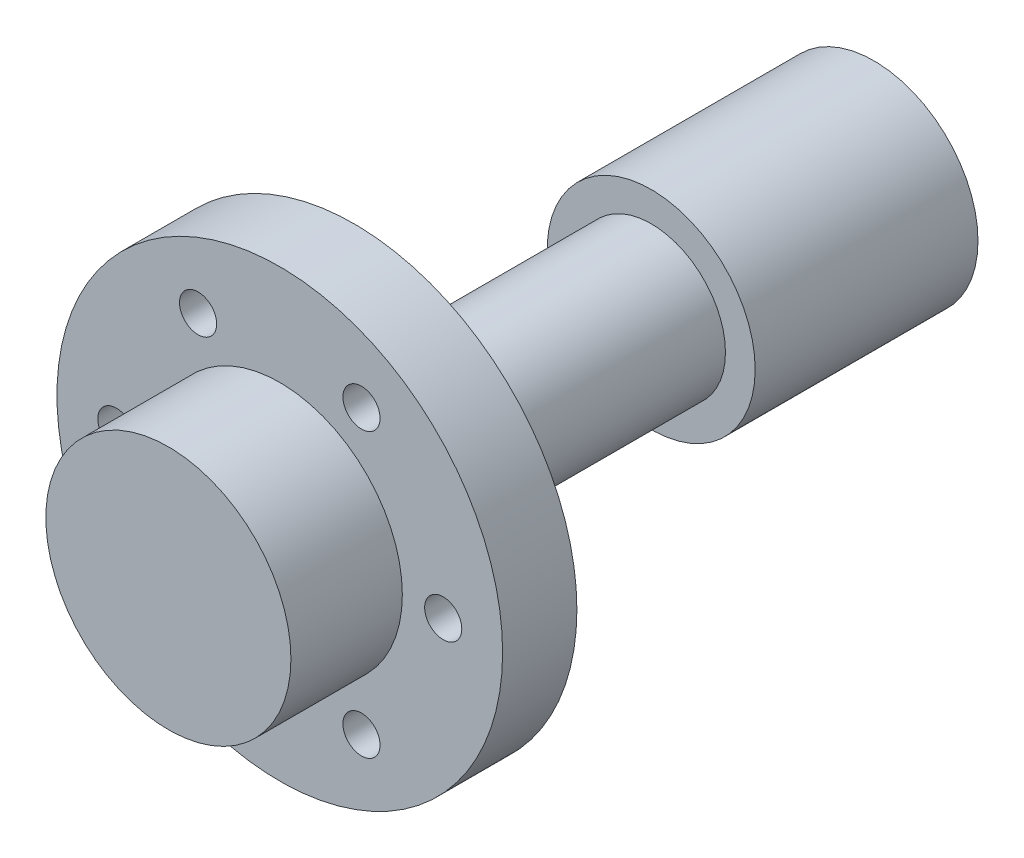
ISO-10303-21;
HEADER;
FILE_DESCRIPTION(('STEP AP214'),'2;1');
FILE_NAME('part.step','',(''),(''),'','','');
FILE_SCHEMA(('AUTOMOTIVE_DESIGN { 1 0 10303 214 1 1 1 1 }'));
ENDSEC;
DATA;
#1=APPLICATION_CONTEXT('core data for automotive mechanical design processes');
#2=APPLICATION_PROTOCOL_DEFINITION('international standard','automotive_design',2000,#1);
#3=PRODUCT_CONTEXT('',#1,'mechanical');
#4=PRODUCT('Part','Part','',(#3));
#5=PRODUCT_RELATED_PRODUCT_CATEGORY('part','',(#4));
#6=PRODUCT_DEFINITION_FORMATION('','',#4);
#7=PRODUCT_DEFINITION_CONTEXT('part definition',#1,'design');
#8=PRODUCT_DEFINITION('design','',#6,#7);
#9=PRODUCT_DEFINITION_SHAPE('','',#8);
#10=(LENGTH_UNIT() NAMED_UNIT(*) SI_UNIT(.MILLI.,.METRE.));
#11=(NAMED_UNIT(*) PLANE_ANGLE_UNIT() SI_UNIT($,.RADIAN.));
#12=(NAMED_UNIT(*) SI_UNIT($,.STERADIAN.) SOLID_ANGLE_UNIT());
#13=UNCERTAINTY_MEASURE_WITH_UNIT(LENGTH_MEASURE(1.E-05),#10,'distance_accuracy_value','');
#14=(GEOMETRIC_REPRESENTATION_CONTEXT(3) GLOBAL_UNCERTAINTY_ASSIGNED_CONTEXT((#13)) GLOBAL_UNIT_ASSIGNED_CONTEXT((#10,
#11,#12)) REPRESENTATION_CONTEXT('',''));
#15=CARTESIAN_POINT('',(0.,0.,0.));
#16=DIRECTION('',(0.,0.,1.));
#17=DIRECTION('',(1.,0.,0.));
#18=AXIS2_PLACEMENT_3D('',#15,#16,#17);
#19=CARTESIAN_POINT('',(0.,0.,30.));
#20=DIRECTION('',(0.,0.,-1.));
#21=DIRECTION('',(-1.,0.,0.));
#22=AXIS2_PLACEMENT_3D('',#19,#20,#21);
#23=CYLINDRICAL_SURFACE('',#22,14.);
#24=CARTESIAN_POINT('',(0.,0.,30.));
#25=DIRECTION('',(0.,0.,1.));
#26=DIRECTION('',(1.,0.,0.));
#27=AXIS2_PLACEMENT_3D('',#24,#25,#26);
#28=CIRCLE('',#27,14.);
#29=CARTESIAN_POINT('',(14.,0.,30.));
#30=VERTEX_POINT('',#29);
#31=EDGE_CURVE('E57',#30,#30,#28,.T.);
#32=ORIENTED_EDGE('',*,*,#31,.F.);
#33=EDGE_LOOP('',(#32));
#34=FACE_BOUND('',#33,.T.);
#35=CARTESIAN_POINT('',(0.,0.,0.));
#36=DIRECTION('',(0.,0.,1.));
#37=DIRECTION('',(1.,0.,0.));
#38=AXIS2_PLACEMENT_3D('',#35,#36,#37);
#39=CIRCLE('',#38,14.);
#40=CARTESIAN_POINT('',(14.,0.,0.));
#41=VERTEX_POINT('',#40);
#42=EDGE_CURVE('E46',#41,#41,#39,.T.);
#43=ORIENTED_EDGE('',*,*,#42,.T.);
#44=EDGE_LOOP('',(#43));
#45=FACE_BOUND('',#44,.T.);
#46=ADVANCED_FACE('F43',(#34,#45),#23,.T.);
#47=CARTESIAN_POINT('',(0.,0.,30.));
#48=DIRECTION('',(0.,0.,1.));
#49=DIRECTION('',(1.,0.,0.));
#50=AXIS2_PLACEMENT_3D('',#47,#48,#49);
#51=PLANE('',#50);
#52=CARTESIAN_POINT('',(0.,0.,30.));
#53=DIRECTION('',(0.,0.,1.));
#54=DIRECTION('',(1.,0.,0.));
#55=AXIS2_PLACEMENT_3D('',#52,#53,#54);
#56=CIRCLE('',#55,10.);
#57=CARTESIAN_POINT('',(10.,0.,30.));
#58=VERTEX_POINT('',#57);
#59=EDGE_CURVE('E51',#58,#58,#56,.T.);
#60=ORIENTED_EDGE('',*,*,#59,.F.);
#61=EDGE_LOOP('',(#60));
#62=FACE_BOUND('',#61,.T.);
#63=ORIENTED_EDGE('',*,*,#31,.T.);
#64=EDGE_LOOP('',(#63));
#65=FACE_BOUND('',#64,.T.);
#66=ADVANCED_FACE('F86',(#62,#65),#51,.T.);
#67=CARTESIAN_POINT('',(0.,0.,0.));
#68=DIRECTION('',(0.,0.,1.));
#69=DIRECTION('',(1.,0.,0.));
#70=AXIS2_PLACEMENT_3D('',#67,#68,#69);
#71=PLANE('',#70);
#72=CARTESIAN_POINT('',(0.,0.,0.));
#73=DIRECTION('',(0.,0.,-1.));
#74=DIRECTION('',(-1.,0.,0.));
#75=AXIS2_PLACEMENT_3D('',#72,#73,#74);
#76=CIRCLE('',#75,7.);
#77=CARTESIAN_POINT('',(-7.,0.,0.));
#78=VERTEX_POINT('',#77);
#79=EDGE_CURVE('E295',#78,#78,#76,.T.);
#80=ORIENTED_EDGE('',*,*,#79,.F.);
#81=EDGE_LOOP('',(#80));
#82=FACE_BOUND('',#81,.T.);
#83=ORIENTED_EDGE('',*,*,#42,.F.);
#84=EDGE_LOOP('',(#83));
#85=FACE_BOUND('',#84,.T.);
#86=ADVANCED_FACE('F83',(#82,#85),#71,.F.);
#87=CARTESIAN_POINT('',(0.,0.,70.));
#88=DIRECTION('',(0.,0.,-1.));
#89=DIRECTION('',(-1.,0.,0.));
#90=AXIS2_PLACEMENT_3D('',#87,#88,#89);
#91=CYLINDRICAL_SURFACE('',#90,10.);
#92=CARTESIAN_POINT('',(0.,0.,70.));
#93=DIRECTION('',(0.,0.,1.));
#94=DIRECTION('',(1.,0.,0.));
#95=AXIS2_PLACEMENT_3D('',#92,#93,#94);
#96=CIRCLE('',#95,10.);
#97=CARTESIAN_POINT('',(10.,0.,70.));
#98=VERTEX_POINT('',#97);
#99=EDGE_CURVE('E67',#98,#98,#96,.T.);
#100=ORIENTED_EDGE('',*,*,#99,.F.);
#101=EDGE_LOOP('',(#100));
#102=FACE_BOUND('',#101,.T.);
#103=ORIENTED_EDGE('',*,*,#59,.T.);
#104=EDGE_LOOP('',(#103));
#105=FACE_BOUND('',#104,.T.);
#106=ADVANCED_FACE('F85',(#102,#105),#91,.T.);
#107=CARTESIAN_POINT('',(0.,0.,80.));
#108=DIRECTION('',(0.,0.,-1.));
#109=DIRECTION('',(-1.,0.,0.));
#110=AXIS2_PLACEMENT_3D('',#107,#108,#109);
#111=CYLINDRICAL_SURFACE('',#110,30.);
#112=CARTESIAN_POINT('',(0.,0.,80.));
#113=DIRECTION('',(0.,0.,1.));
#114=DIRECTION('',(1.,0.,0.));
#115=AXIS2_PLACEMENT_3D('',#112,#113,#114);
#116=CIRCLE('',#115,30.);
#117=CARTESIAN_POINT('',(30.,0.,80.));
#118=VERTEX_POINT('',#117);
#119=EDGE_CURVE('E63',#118,#118,#116,.T.);
#120=ORIENTED_EDGE('',*,*,#119,.F.);
#121=EDGE_LOOP('',(#120));
#122=FACE_BOUND('',#121,.T.);
#123=CARTESIAN_POINT('',(0.,0.,70.));
#124=DIRECTION('',(0.,0.,1.));
#125=DIRECTION('',(1.,0.,0.));
#126=AXIS2_PLACEMENT_3D('',#123,#124,#125);
#127=CIRCLE('',#126,30.);
#128=CARTESIAN_POINT('',(30.,0.,70.));
#129=VERTEX_POINT('',#128);
#130=EDGE_CURVE('E68',#129,#129,#127,.T.);
#131=ORIENTED_EDGE('',*,*,#130,.T.);
#132=EDGE_LOOP('',(#131));
#133=FACE_BOUND('',#132,.T.);
#134=ADVANCED_FACE('F93',(#122,#133),#111,.T.);
#135=CARTESIAN_POINT('',(0.,0.,80.));
#136=DIRECTION('',(0.,0.,1.));
#137=DIRECTION('',(1.,0.,0.));
#138=AXIS2_PLACEMENT_3D('',#135,#136,#137);
#139=PLANE('',#138);
#140=CARTESIAN_POINT('',(22.,0.,80.));
#141=DIRECTION('',(0.,0.,1.));
#142=DIRECTION('',(1.,0.,0.));
#143=AXIS2_PLACEMENT_3D('',#140,#141,#142);
#144=CIRCLE('',#143,2.5);
#145=CARTESIAN_POINT('',(24.5,0.,80.));
#146=VERTEX_POINT('',#145);
#147=EDGE_CURVE('E271',#146,#146,#144,.T.);
#148=ORIENTED_EDGE('',*,*,#147,.F.);
#149=EDGE_LOOP('',(#148));
#150=FACE_BOUND('',#149,.T.);
#151=CARTESIAN_POINT('',(11.,-19.0525588832576,80.));
#152=DIRECTION('',(0.,0.,1.));
#153=DIRECTION('',(1.,0.,0.));
#154=AXIS2_PLACEMENT_3D('',#151,#152,#153);
#155=CIRCLE('',#154,2.49999999999988);
#156=CARTESIAN_POINT('',(13.4999999999999,-19.0525588832576,80.));
#157=VERTEX_POINT('',#156);
#158=EDGE_CURVE('E291',#157,#157,#155,.T.);
#159=ORIENTED_EDGE('',*,*,#158,.F.);
#160=EDGE_LOOP('',(#159));
#161=FACE_BOUND('',#160,.T.);
#162=CARTESIAN_POINT('',(-11.,-19.0525588832576,80.));
#163=DIRECTION('',(0.,0.,1.));
#164=DIRECTION('',(1.,0.,0.));
#165=AXIS2_PLACEMENT_3D('',#162,#163,#164);
#166=CIRCLE('',#165,2.49999999999989);
#167=CARTESIAN_POINT('',(-8.50000000000007,-19.0525588832576,80.));
#168=VERTEX_POINT('',#167);
#169=EDGE_CURVE('E285',#168,#168,#166,.T.);
#170=ORIENTED_EDGE('',*,*,#169,.F.);
#171=EDGE_LOOP('',(#170));
#172=FACE_BOUND('',#171,.T.);
#173=CARTESIAN_POINT('',(-22.,0.,80.));
#174=DIRECTION('',(0.,0.,1.));
#175=DIRECTION('',(1.,0.,0.));
#176=AXIS2_PLACEMENT_3D('',#173,#174,#175);
#177=CIRCLE('',#176,2.5);
#178=CARTESIAN_POINT('',(-19.5,0.,80.));
#179=VERTEX_POINT('',#178);
#180=EDGE_CURVE('E279',#179,#179,#177,.T.);
#181=ORIENTED_EDGE('',*,*,#180,.F.);
#182=EDGE_LOOP('',(#181));
#183=FACE_BOUND('',#182,.T.);
#184=CARTESIAN_POINT('',(-11.,19.0525588832576,80.));
#185=DIRECTION('',(0.,0.,1.));
#186=DIRECTION('',(1.,0.,0.));
#187=AXIS2_PLACEMENT_3D('',#184,#185,#186);
#188=CIRCLE('',#187,2.5);
#189=CARTESIAN_POINT('',(-8.49999999999996,19.0525588832576,80.));
#190=VERTEX_POINT('',#189);
#191=EDGE_CURVE('E266',#190,#190,#188,.T.);
#192=ORIENTED_EDGE('',*,*,#191,.F.);
#193=EDGE_LOOP('',(#192));
#194=FACE_BOUND('',#193,.T.);
#195=CARTESIAN_POINT('',(11.,19.0525588832576,80.));
#196=DIRECTION('',(0.,0.,1.));
#197=DIRECTION('',(1.,0.,0.));
#198=AXIS2_PLACEMENT_3D('',#195,#196,#197);
#199=CIRCLE('',#198,2.5);
#200=CARTESIAN_POINT('',(13.5,19.0525588832576,80.));
#201=VERTEX_POINT('',#200);
#202=EDGE_CURVE('E265',#201,#201,#199,.T.);
#203=ORIENTED_EDGE('',*,*,#202,.F.);
#204=EDGE_LOOP('',(#203));
#205=FACE_BOUND('',#204,.T.);
#206=CARTESIAN_POINT('',(0.,0.,80.));
#207=DIRECTION('',(0.,0.,1.));
#208=DIRECTION('',(1.,0.,0.));
#209=AXIS2_PLACEMENT_3D('',#206,#207,#208);
#210=CIRCLE('',#209,16.5);
#211=CARTESIAN_POINT('',(16.5,0.,80.));
#212=VERTEX_POINT('',#211);
#213=EDGE_CURVE('E10',#212,#212,#210,.T.);
#214=ORIENTED_EDGE('',*,*,#213,.F.);
#215=EDGE_LOOP('',(#214));
#216=FACE_BOUND('',#215,.T.);
#217=ORIENTED_EDGE('',*,*,#119,.T.);
#218=EDGE_LOOP('',(#217));
#219=FACE_BOUND('',#218,.T.);
#220=ADVANCED_FACE('F121',(#150,#161,#172,#183,#194,#205,#216,#219),#139,.T.);
#221=CARTESIAN_POINT('',(0.,0.,70.));
#222=DIRECTION('',(0.,0.,1.));
#223=DIRECTION('',(1.,0.,0.));
#224=AXIS2_PLACEMENT_3D('',#221,#222,#223);
#225=PLANE('',#224);
#226=CARTESIAN_POINT('',(22.,0.,70.));
#227=DIRECTION('',(0.,0.,1.));
#228=DIRECTION('',(1.,0.,0.));
#229=AXIS2_PLACEMENT_3D('',#226,#227,#228);
#230=CIRCLE('',#229,2.5);
#231=CARTESIAN_POINT('',(24.5,0.,70.));
#232=VERTEX_POINT('',#231);
#233=EDGE_CURVE('E237',#232,#232,#230,.T.);
#234=ORIENTED_EDGE('',*,*,#233,.T.);
#235=EDGE_LOOP('',(#234));
#236=FACE_BOUND('',#235,.T.);
#237=CARTESIAN_POINT('',(11.,-19.0525588832576,70.));
#238=DIRECTION('',(0.,0.,1.));
#239=DIRECTION('',(1.,0.,0.));
#240=AXIS2_PLACEMENT_3D('',#237,#238,#239);
#241=CIRCLE('',#240,2.49999999999988);
#242=CARTESIAN_POINT('',(13.4999999999999,-19.0525588832576,70.));
#243=VERTEX_POINT('',#242);
#244=EDGE_CURVE('E241',#243,#243,#241,.T.);
#245=ORIENTED_EDGE('',*,*,#244,.T.);
#246=EDGE_LOOP('',(#245));
#247=FACE_BOUND('',#246,.T.);
#248=CARTESIAN_POINT('',(-11.,-19.0525588832576,70.));
#249=DIRECTION('',(0.,0.,1.));
#250=DIRECTION('',(1.,0.,0.));
#251=AXIS2_PLACEMENT_3D('',#248,#249,#250);
#252=CIRCLE('',#251,2.49999999999989);
#253=CARTESIAN_POINT('',(-8.50000000000007,-19.0525588832576,70.));
#254=VERTEX_POINT('',#253);
#255=EDGE_CURVE('E245',#254,#254,#252,.T.);
#256=ORIENTED_EDGE('',*,*,#255,.T.);
#257=EDGE_LOOP('',(#256));
#258=FACE_BOUND('',#257,.T.);
#259=CARTESIAN_POINT('',(-22.,0.,70.));
#260=DIRECTION('',(0.,0.,1.));
#261=DIRECTION('',(1.,0.,0.));
#262=AXIS2_PLACEMENT_3D('',#259,#260,#261);
#263=CIRCLE('',#262,2.5);
#264=CARTESIAN_POINT('',(-19.5,0.,70.));
#265=VERTEX_POINT('',#264);
#266=EDGE_CURVE('E249',#265,#265,#263,.T.);
#267=ORIENTED_EDGE('',*,*,#266,.T.);
#268=EDGE_LOOP('',(#267));
#269=FACE_BOUND('',#268,.T.);
#270=CARTESIAN_POINT('',(-11.,19.0525588832576,70.));
#271=DIRECTION('',(0.,0.,1.));
#272=DIRECTION('',(1.,0.,0.));
#273=AXIS2_PLACEMENT_3D('',#270,#271,#272);
#274=CIRCLE('',#273,2.5);
#275=CARTESIAN_POINT('',(-8.49999999999996,19.0525588832576,70.));
#276=VERTEX_POINT('',#275);
#277=EDGE_CURVE('E253',#276,#276,#274,.T.);
#278=ORIENTED_EDGE('',*,*,#277,.T.);
#279=EDGE_LOOP('',(#278));
#280=FACE_BOUND('',#279,.T.);
#281=CARTESIAN_POINT('',(11.,19.0525588832576,70.));
#282=DIRECTION('',(0.,0.,1.));
#283=DIRECTION('',(1.,0.,0.));
#284=AXIS2_PLACEMENT_3D('',#281,#282,#283);
#285=CIRCLE('',#284,2.5);
#286=CARTESIAN_POINT('',(13.5,19.0525588832576,70.));
#287=VERTEX_POINT('',#286);
#288=EDGE_CURVE('E257',#287,#287,#285,.T.);
#289=ORIENTED_EDGE('',*,*,#288,.T.);
#290=EDGE_LOOP('',(#289));
#291=FACE_BOUND('',#290,.T.);
#292=ORIENTED_EDGE('',*,*,#99,.T.);
#293=EDGE_LOOP('',(#292));
#294=FACE_BOUND('',#293,.T.);
#295=ORIENTED_EDGE('',*,*,#130,.F.);
#296=EDGE_LOOP('',(#295));
#297=FACE_BOUND('',#296,.T.);
#298=ADVANCED_FACE('F132',(#236,#247,#258,#269,#280,#291,#294,#297),#225,.F.);
#299=CARTESIAN_POINT('',(0.,0.,95.));
#300=DIRECTION('',(0.,0.,-1.));
#301=DIRECTION('',(-1.,0.,0.));
#302=AXIS2_PLACEMENT_3D('',#299,#300,#301);
#303=CYLINDRICAL_SURFACE('',#302,16.5);
#304=CARTESIAN_POINT('',(0.,0.,95.));
#305=DIRECTION('',(0.,0.,1.));
#306=DIRECTION('',(1.,0.,0.));
#307=AXIS2_PLACEMENT_3D('',#304,#305,#306);
#308=CIRCLE('',#307,16.5);
#309=CARTESIAN_POINT('',(16.5,0.,95.));
#310=VERTEX_POINT('',#309);
#311=EDGE_CURVE('E61',#310,#310,#308,.T.);
#312=ORIENTED_EDGE('',*,*,#311,.F.);
#313=EDGE_LOOP('',(#312));
#314=FACE_BOUND('',#313,.T.);
#315=ORIENTED_EDGE('',*,*,#213,.T.);
#316=EDGE_LOOP('',(#315));
#317=FACE_BOUND('',#316,.T.);
#318=ADVANCED_FACE('F128',(#314,#317),#303,.T.);
#319=CARTESIAN_POINT('',(0.,0.,95.));
#320=DIRECTION('',(0.,0.,1.));
#321=DIRECTION('',(1.,0.,0.));
#322=AXIS2_PLACEMENT_3D('',#319,#320,#321);
#323=PLANE('',#322);
#324=ORIENTED_EDGE('',*,*,#311,.T.);
#325=EDGE_LOOP('',(#324));
#326=FACE_BOUND('',#325,.T.);
#327=ADVANCED_FACE('F131',(#326),#323,.T.);
#328=CARTESIAN_POINT('',(0.,0.,25.));
#329=DIRECTION('',(0.,0.,-1.));
#330=DIRECTION('',(-1.,0.,0.));
#331=AXIS2_PLACEMENT_3D('',#328,#329,#330);
#332=CYLINDRICAL_SURFACE('',#331,7.);
#333=CARTESIAN_POINT('',(0.,0.,25.));
#334=DIRECTION('',(0.,0.,-1.));
#335=DIRECTION('',(-1.,0.,0.));
#336=AXIS2_PLACEMENT_3D('',#333,#334,#335);
#337=CIRCLE('',#336,7.);
#338=CARTESIAN_POINT('',(-7.,0.,25.));
#339=VERTEX_POINT('',#338);
#340=EDGE_CURVE('E292',#339,#339,#337,.T.);
#341=ORIENTED_EDGE('',*,*,#340,.F.);
#342=EDGE_LOOP('',(#341));
#343=FACE_BOUND('',#342,.T.);
#344=ORIENTED_EDGE('',*,*,#79,.T.);
#345=EDGE_LOOP('',(#344));
#346=FACE_BOUND('',#345,.T.);
#347=ADVANCED_FACE('F141',(#343,#346),#332,.F.);
#348=CARTESIAN_POINT('',(0.,0.,25.));
#349=DIRECTION('',(0.,0.,-1.));
#350=DIRECTION('',(-1.,0.,0.));
#351=AXIS2_PLACEMENT_3D('',#348,#349,#350);
#352=PLANE('',#351);
#353=ORIENTED_EDGE('',*,*,#340,.T.);
#354=EDGE_LOOP('',(#353));
#355=FACE_BOUND('',#354,.T.);
#356=ADVANCED_FACE('F153',(#355),#352,.T.);
#357=CARTESIAN_POINT('',(11.,19.0525588832576,70.));
#358=DIRECTION('',(0.,0.,1.));
#359=DIRECTION('',(1.,0.,0.));
#360=AXIS2_PLACEMENT_3D('',#357,#358,#359);
#361=CYLINDRICAL_SURFACE('',#360,2.5);
#362=ORIENTED_EDGE('',*,*,#288,.F.);
#363=EDGE_LOOP('',(#362));
#364=FACE_BOUND('',#363,.T.);
#365=ORIENTED_EDGE('',*,*,#202,.T.);
#366=EDGE_LOOP('',(#365));
#367=FACE_BOUND('',#366,.T.);
#368=ADVANCED_FACE('F163',(#364,#367),#361,.F.);
#369=CARTESIAN_POINT('',(-11.,19.0525588832576,70.));
#370=DIRECTION('',(0.,0.,1.));
#371=DIRECTION('',(1.,0.,0.));
#372=AXIS2_PLACEMENT_3D('',#369,#370,#371);
#373=CYLINDRICAL_SURFACE('',#372,2.5);
#374=ORIENTED_EDGE('',*,*,#277,.F.);
#375=EDGE_LOOP('',(#374));
#376=FACE_BOUND('',#375,.T.);
#377=ORIENTED_EDGE('',*,*,#191,.T.);
#378=EDGE_LOOP('',(#377));
#379=FACE_BOUND('',#378,.T.);
#380=ADVANCED_FACE('F174',(#376,#379),#373,.F.);
#381=CARTESIAN_POINT('',(-22.,0.,70.));
#382=DIRECTION('',(0.,0.,1.));
#383=DIRECTION('',(1.,0.,0.));
#384=AXIS2_PLACEMENT_3D('',#381,#382,#383);
#385=CYLINDRICAL_SURFACE('',#384,2.5);
#386=ORIENTED_EDGE('',*,*,#266,.F.);
#387=EDGE_LOOP('',(#386));
#388=FACE_BOUND('',#387,.T.);
#389=ORIENTED_EDGE('',*,*,#180,.T.);
#390=EDGE_LOOP('',(#389));
#391=FACE_BOUND('',#390,.T.);
#392=ADVANCED_FACE('F185',(#388,#391),#385,.F.);
#393=CARTESIAN_POINT('',(-11.,-19.0525588832576,70.));
#394=DIRECTION('',(0.,0.,1.));
#395=DIRECTION('',(1.,0.,0.));
#396=AXIS2_PLACEMENT_3D('',#393,#394,#395);
#397=CYLINDRICAL_SURFACE('',#396,2.49999999999989);
#398=ORIENTED_EDGE('',*,*,#255,.F.);
#399=EDGE_LOOP('',(#398));
#400=FACE_BOUND('',#399,.T.);
#401=ORIENTED_EDGE('',*,*,#169,.T.);
#402=EDGE_LOOP('',(#401));
#403=FACE_BOUND('',#402,.T.);
#404=ADVANCED_FACE('F195',(#400,#403),#397,.F.);
#405=CARTESIAN_POINT('',(11.,-19.0525588832576,70.));
#406=DIRECTION('',(0.,0.,1.));
#407=DIRECTION('',(1.,0.,0.));
#408=AXIS2_PLACEMENT_3D('',#405,#406,#407);
#409=CYLINDRICAL_SURFACE('',#408,2.49999999999988);
#410=ORIENTED_EDGE('',*,*,#244,.F.);
#411=EDGE_LOOP('',(#410));
#412=FACE_BOUND('',#411,.T.);
#413=ORIENTED_EDGE('',*,*,#158,.T.);
#414=EDGE_LOOP('',(#413));
#415=FACE_BOUND('',#414,.T.);
#416=ADVANCED_FACE('F205',(#412,#415),#409,.F.);
#417=CARTESIAN_POINT('',(22.,0.,70.));
#418=DIRECTION('',(0.,0.,1.));
#419=DIRECTION('',(1.,0.,0.));
#420=AXIS2_PLACEMENT_3D('',#417,#418,#419);
#421=CYLINDRICAL_SURFACE('',#420,2.5);
#422=ORIENTED_EDGE('',*,*,#233,.F.);
#423=EDGE_LOOP('',(#422));
#424=FACE_BOUND('',#423,.T.);
#425=ORIENTED_EDGE('',*,*,#147,.T.);
#426=EDGE_LOOP('',(#425));
#427=FACE_BOUND('',#426,.T.);
#428=ADVANCED_FACE('F215',(#424,#427),#421,.F.);
#429=CLOSED_SHELL('',(#46,#66,#86,#106,#134,#220,#298,#318,#327,#347,#356,#368,#380,#392,#404,
#416,#428));
#430=MANIFOLD_SOLID_BREP('B2',#429);
#431=ADVANCED_BREP_SHAPE_REPRESENTATION('',(#18,#430),#14);
#432=SHAPE_DEFINITION_REPRESENTATION(#9,#431);
ENDSEC;
END-ISO-10303-21;
